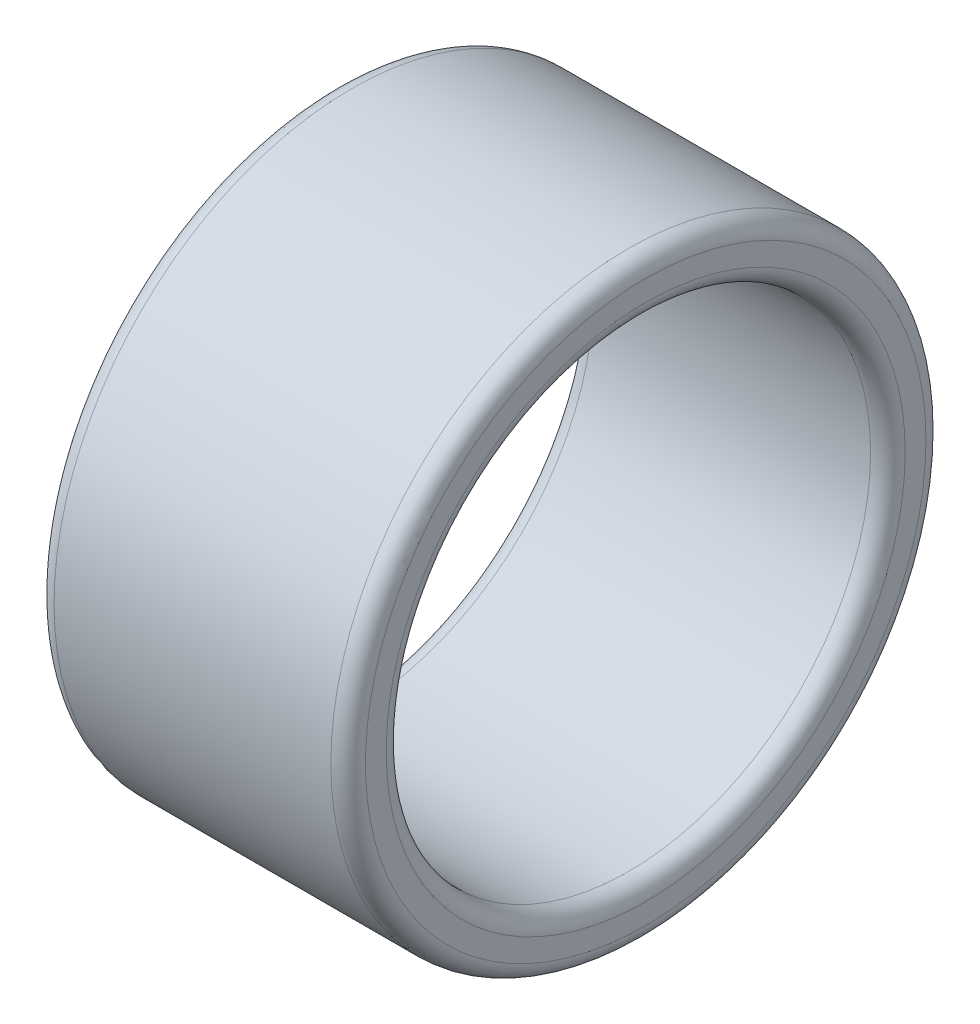
ISO-10303-21;
HEADER;
FILE_DESCRIPTION(('STEP AP214'),'2;1');
FILE_NAME('part.step','',(''),(''),'','','');
FILE_SCHEMA(('AUTOMOTIVE_DESIGN { 1 0 10303 214 1 1 1 1 }'));
ENDSEC;
DATA;
#1=APPLICATION_CONTEXT('core data for automotive mechanical design processes');
#2=APPLICATION_PROTOCOL_DEFINITION('international standard','automotive_design',2000,#1);
#3=PRODUCT_CONTEXT('',#1,'mechanical');
#4=PRODUCT('Part','Part','',(#3));
#5=PRODUCT_RELATED_PRODUCT_CATEGORY('part','',(#4));
#6=PRODUCT_DEFINITION_FORMATION('','',#4);
#7=PRODUCT_DEFINITION_CONTEXT('part definition',#1,'design');
#8=PRODUCT_DEFINITION('design','',#6,#7);
#9=PRODUCT_DEFINITION_SHAPE('','',#8);
#10=(LENGTH_UNIT() NAMED_UNIT(*) SI_UNIT(.MILLI.,.METRE.));
#11=(NAMED_UNIT(*) PLANE_ANGLE_UNIT() SI_UNIT($,.RADIAN.));
#12=(NAMED_UNIT(*) SI_UNIT($,.STERADIAN.) SOLID_ANGLE_UNIT());
#13=UNCERTAINTY_MEASURE_WITH_UNIT(LENGTH_MEASURE(1.E-05),#10,'distance_accuracy_value','');
#14=(GEOMETRIC_REPRESENTATION_CONTEXT(3) GLOBAL_UNCERTAINTY_ASSIGNED_CONTEXT((#13)) GLOBAL_UNIT_ASSIGNED_CONTEXT((#10,
#11,#12)) REPRESENTATION_CONTEXT('',''));
#15=CARTESIAN_POINT('',(0.,0.,0.));
#16=DIRECTION('',(0.,0.,1.));
#17=DIRECTION('',(1.,0.,0.));
#18=AXIS2_PLACEMENT_3D('',#15,#16,#17);
#19=CARTESIAN_POINT('',(36.,0.,0.));
#20=DIRECTION('',(1.,0.,0.));
#21=DIRECTION('',(0.,0.,-1.));
#22=AXIS2_PLACEMENT_3D('',#19,#20,#21);
#23=PLANE('',#22);
#24=CARTESIAN_POINT('',(36.,0.,0.));
#25=DIRECTION('',(1.,0.,0.));
#26=DIRECTION('',(0.,0.,-1.));
#27=AXIS2_PLACEMENT_3D('',#24,#25,#26);
#28=CIRCLE('',#27,30.);
#29=CARTESIAN_POINT('',(36.,0.,-30.));
#30=VERTEX_POINT('',#29);
#31=EDGE_CURVE('E62',#30,#30,#28,.F.);
#32=ORIENTED_EDGE('',*,*,#31,.T.);
#33=EDGE_LOOP('',(#32));
#34=FACE_BOUND('',#33,.T.);
#35=CARTESIAN_POINT('',(36.,0.,0.));
#36=DIRECTION('',(1.,0.,0.));
#37=DIRECTION('',(0.,0.,-1.));
#38=AXIS2_PLACEMENT_3D('',#35,#36,#37);
#39=CIRCLE('',#38,32.4);
#40=CARTESIAN_POINT('',(36.,0.,-32.4));
#41=VERTEX_POINT('',#40);
#42=EDGE_CURVE('E67',#41,#41,#39,.T.);
#43=ORIENTED_EDGE('',*,*,#42,.T.);
#44=EDGE_LOOP('',(#43));
#45=FACE_BOUND('',#44,.T.);
#46=ADVANCED_FACE('F49',(#34,#45),#23,.T.);
#47=CARTESIAN_POINT('',(0.,0.,0.));
#48=DIRECTION('',(1.,0.,0.));
#49=DIRECTION('',(0.,0.,-1.));
#50=AXIS2_PLACEMENT_3D('',#47,#48,#49);
#51=PLANE('',#50);
#52=CARTESIAN_POINT('',(0.,0.,0.));
#53=DIRECTION('',(1.,0.,0.));
#54=DIRECTION('',(0.,0.,-1.));
#55=AXIS2_PLACEMENT_3D('',#52,#53,#54);
#56=CIRCLE('',#55,30.);
#57=CARTESIAN_POINT('',(0.,0.,-30.));
#58=VERTEX_POINT('',#57);
#59=EDGE_CURVE('E81',#58,#58,#56,.T.);
#60=ORIENTED_EDGE('',*,*,#59,.T.);
#61=EDGE_LOOP('',(#60));
#62=FACE_BOUND('',#61,.T.);
#63=CARTESIAN_POINT('',(0.,0.,0.));
#64=DIRECTION('',(1.,0.,0.));
#65=DIRECTION('',(0.,0.,-1.));
#66=AXIS2_PLACEMENT_3D('',#63,#64,#65);
#67=CIRCLE('',#66,32.4);
#68=CARTESIAN_POINT('',(0.,0.,-32.4));
#69=VERTEX_POINT('',#68);
#70=EDGE_CURVE('E85',#69,#69,#67,.F.);
#71=ORIENTED_EDGE('',*,*,#70,.T.);
#72=EDGE_LOOP('',(#71));
#73=FACE_BOUND('',#72,.T.);
#74=ADVANCED_FACE('F90',(#62,#73),#51,.F.);
#75=CARTESIAN_POINT('',(36.,0.,0.));
#76=DIRECTION('',(-1.,0.,0.));
#77=DIRECTION('',(0.,0.,1.));
#78=AXIS2_PLACEMENT_3D('',#75,#76,#77);
#79=CYLINDRICAL_SURFACE('',#78,34.4);
#80=CARTESIAN_POINT('',(34.,0.,0.));
#81=DIRECTION('',(1.,0.,0.));
#82=DIRECTION('',(0.,0.,-1.));
#83=AXIS2_PLACEMENT_3D('',#80,#81,#82);
#84=CIRCLE('',#83,34.4);
#85=CARTESIAN_POINT('',(34.,0.,-34.4));
#86=VERTEX_POINT('',#85);
#87=EDGE_CURVE('E10',#86,#86,#84,.F.);
#88=ORIENTED_EDGE('',*,*,#87,.T.);
#89=EDGE_LOOP('',(#88));
#90=FACE_BOUND('',#89,.T.);
#91=CARTESIAN_POINT('',(2.,0.,0.));
#92=DIRECTION('',(1.,0.,0.));
#93=DIRECTION('',(0.,0.,-1.));
#94=AXIS2_PLACEMENT_3D('',#91,#92,#93);
#95=CIRCLE('',#94,34.4);
#96=CARTESIAN_POINT('',(2.,0.,-34.4));
#97=VERTEX_POINT('',#96);
#98=EDGE_CURVE('E57',#97,#97,#95,.T.);
#99=ORIENTED_EDGE('',*,*,#98,.T.);
#100=EDGE_LOOP('',(#99));
#101=FACE_BOUND('',#100,.T.);
#102=ADVANCED_FACE('F107',(#90,#101),#79,.T.);
#103=CARTESIAN_POINT('',(36.,0.,0.));
#104=DIRECTION('',(-1.,0.,0.));
#105=DIRECTION('',(0.,0.,1.));
#106=AXIS2_PLACEMENT_3D('',#103,#104,#105);
#107=CYLINDRICAL_SURFACE('',#106,28.);
#108=CARTESIAN_POINT('',(2.,0.,0.));
#109=DIRECTION('',(1.,0.,0.));
#110=DIRECTION('',(0.,0.,-1.));
#111=AXIS2_PLACEMENT_3D('',#108,#109,#110);
#112=CIRCLE('',#111,28.);
#113=CARTESIAN_POINT('',(2.,0.,-28.));
#114=VERTEX_POINT('',#113);
#115=EDGE_CURVE('E73',#114,#114,#112,.F.);
#116=ORIENTED_EDGE('',*,*,#115,.T.);
#117=EDGE_LOOP('',(#116));
#118=FACE_BOUND('',#117,.T.);
#119=CARTESIAN_POINT('',(34.,0.,0.));
#120=DIRECTION('',(1.,0.,0.));
#121=DIRECTION('',(0.,0.,-1.));
#122=AXIS2_PLACEMENT_3D('',#119,#120,#121);
#123=CIRCLE('',#122,28.);
#124=CARTESIAN_POINT('',(34.,0.,-28.));
#125=VERTEX_POINT('',#124);
#126=EDGE_CURVE('E77',#125,#125,#123,.T.);
#127=ORIENTED_EDGE('',*,*,#126,.T.);
#128=EDGE_LOOP('',(#127));
#129=FACE_BOUND('',#128,.T.);
#130=ADVANCED_FACE('F112',(#118,#129),#107,.F.);
#131=CARTESIAN_POINT('',(2.,0.,0.));
#132=DIRECTION('',(1.,0.,0.));
#133=DIRECTION('',(0.,0.,-1.));
#134=AXIS2_PLACEMENT_3D('',#131,#132,#133);
#135=TOROIDAL_SURFACE('',#134,30.,2.);
#136=ORIENTED_EDGE('',*,*,#115,.F.);
#137=EDGE_LOOP('',(#136));
#138=FACE_BOUND('',#137,.T.);
#139=ORIENTED_EDGE('',*,*,#59,.F.);
#140=EDGE_LOOP('',(#139));
#141=FACE_BOUND('',#140,.T.);
#142=ADVANCED_FACE('F116',(#138,#141),#135,.T.);
#143=CARTESIAN_POINT('',(34.,0.,0.));
#144=DIRECTION('',(1.,0.,0.));
#145=DIRECTION('',(0.,0.,-1.));
#146=AXIS2_PLACEMENT_3D('',#143,#144,#145);
#147=TOROIDAL_SURFACE('',#146,30.,2.);
#148=ORIENTED_EDGE('',*,*,#31,.F.);
#149=EDGE_LOOP('',(#148));
#150=FACE_BOUND('',#149,.T.);
#151=ORIENTED_EDGE('',*,*,#126,.F.);
#152=EDGE_LOOP('',(#151));
#153=FACE_BOUND('',#152,.T.);
#154=ADVANCED_FACE('F99',(#150,#153),#147,.T.);
#155=CARTESIAN_POINT('',(34.,0.,0.));
#156=DIRECTION('',(1.,0.,0.));
#157=DIRECTION('',(0.,0.,-1.));
#158=AXIS2_PLACEMENT_3D('',#155,#156,#157);
#159=TOROIDAL_SURFACE('',#158,32.4,2.);
#160=ORIENTED_EDGE('',*,*,#87,.F.);
#161=EDGE_LOOP('',(#160));
#162=FACE_BOUND('',#161,.T.);
#163=ORIENTED_EDGE('',*,*,#42,.F.);
#164=EDGE_LOOP('',(#163));
#165=FACE_BOUND('',#164,.T.);
#166=ADVANCED_FACE('F94',(#162,#165),#159,.T.);
#167=CARTESIAN_POINT('',(2.,0.,0.));
#168=DIRECTION('',(1.,0.,0.));
#169=DIRECTION('',(0.,0.,-1.));
#170=AXIS2_PLACEMENT_3D('',#167,#168,#169);
#171=TOROIDAL_SURFACE('',#170,32.4,2.);
#172=ORIENTED_EDGE('',*,*,#70,.F.);
#173=EDGE_LOOP('',(#172));
#174=FACE_BOUND('',#173,.T.);
#175=ORIENTED_EDGE('',*,*,#98,.F.);
#176=EDGE_LOOP('',(#175));
#177=FACE_BOUND('',#176,.T.);
#178=ADVANCED_FACE('F51',(#174,#177),#171,.T.);
#179=CLOSED_SHELL('',(#46,#74,#102,#130,#142,#154,#166,#178));
#180=MANIFOLD_SOLID_BREP('B2',#179);
#181=ADVANCED_BREP_SHAPE_REPRESENTATION('',(#18,#180),#14);
#182=SHAPE_DEFINITION_REPRESENTATION(#9,#181);
ENDSEC;
END-ISO-10303-21;
